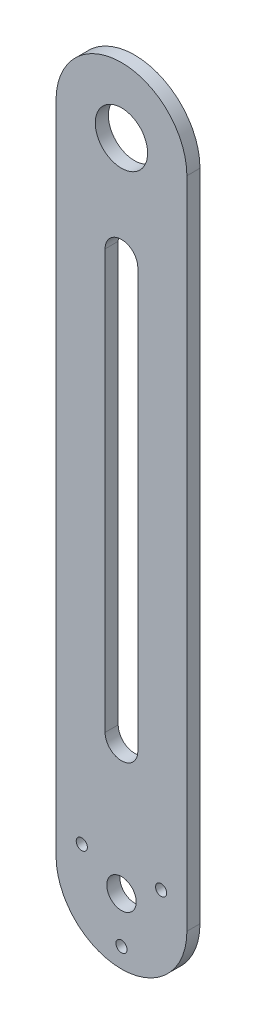
ISO-10303-21;
HEADER;
FILE_DESCRIPTION(('STEP AP214'),'2;1');
FILE_NAME('part.step','',(''),(''),'','','');
FILE_SCHEMA(('AUTOMOTIVE_DESIGN { 1 0 10303 214 1 1 1 1 }'));
ENDSEC;
DATA;
#1=APPLICATION_CONTEXT('core data for automotive mechanical design processes');
#2=APPLICATION_PROTOCOL_DEFINITION('international standard','automotive_design',2000,#1);
#3=PRODUCT_CONTEXT('',#1,'mechanical');
#4=PRODUCT('Part','Part','',(#3));
#5=PRODUCT_RELATED_PRODUCT_CATEGORY('part','',(#4));
#6=PRODUCT_DEFINITION_FORMATION('','',#4);
#7=PRODUCT_DEFINITION_CONTEXT('part definition',#1,'design');
#8=PRODUCT_DEFINITION('design','',#6,#7);
#9=PRODUCT_DEFINITION_SHAPE('','',#8);
#10=(LENGTH_UNIT() NAMED_UNIT(*) SI_UNIT(.MILLI.,.METRE.));
#11=(NAMED_UNIT(*) PLANE_ANGLE_UNIT() SI_UNIT($,.RADIAN.));
#12=(NAMED_UNIT(*) SI_UNIT($,.STERADIAN.) SOLID_ANGLE_UNIT());
#13=UNCERTAINTY_MEASURE_WITH_UNIT(LENGTH_MEASURE(1.E-05),#10,'distance_accuracy_value','');
#14=(GEOMETRIC_REPRESENTATION_CONTEXT(3) GLOBAL_UNCERTAINTY_ASSIGNED_CONTEXT((#13)) GLOBAL_UNIT_ASSIGNED_CONTEXT((#10,
#11,#12)) REPRESENTATION_CONTEXT('',''));
#15=CARTESIAN_POINT('',(0.,0.,0.));
#16=DIRECTION('',(0.,0.,1.));
#17=DIRECTION('',(1.,0.,0.));
#18=AXIS2_PLACEMENT_3D('',#15,#16,#17);
#19=CARTESIAN_POINT('',(0.,-200.,4.));
#20=DIRECTION('',(0.,0.,1.));
#21=DIRECTION('',(1.,0.,0.));
#22=AXIS2_PLACEMENT_3D('',#19,#20,#21);
#23=PLANE('',#22);
#24=CARTESIAN_POINT('',(0.,-214.,4.));
#25=DIRECTION('',(0.,0.,-1.));
#26=DIRECTION('',(-1.,0.,0.));
#27=AXIS2_PLACEMENT_3D('',#24,#25,#26);
#28=CIRCLE('',#27,1.7);
#29=CARTESIAN_POINT('',(-1.69999999999998,-214.,4.));
#30=VERTEX_POINT('',#29);
#31=EDGE_CURVE('E130',#30,#30,#28,.T.);
#32=ORIENTED_EDGE('',*,*,#31,.T.);
#33=EDGE_LOOP('',(#32));
#34=FACE_BOUND('',#33,.T.);
#35=CARTESIAN_POINT('',(12.1243556529821,-193.,4.));
#36=DIRECTION('',(0.,0.,-1.));
#37=DIRECTION('',(-1.,0.,0.));
#38=AXIS2_PLACEMENT_3D('',#35,#36,#37);
#39=CIRCLE('',#38,1.70000000000002);
#40=CARTESIAN_POINT('',(10.4243556529821,-193.,4.));
#41=VERTEX_POINT('',#40);
#42=EDGE_CURVE('E264',#41,#41,#39,.T.);
#43=ORIENTED_EDGE('',*,*,#42,.T.);
#44=EDGE_LOOP('',(#43));
#45=FACE_BOUND('',#44,.T.);
#46=CARTESIAN_POINT('',(-12.1243556529821,-193.,4.));
#47=DIRECTION('',(0.,0.,-1.));
#48=DIRECTION('',(-1.,0.,0.));
#49=AXIS2_PLACEMENT_3D('',#46,#47,#48);
#50=CIRCLE('',#49,1.69999999999999);
#51=CARTESIAN_POINT('',(-13.8243556529821,-193.,4.));
#52=VERTEX_POINT('',#51);
#53=EDGE_CURVE('E272',#52,#52,#50,.T.);
#54=ORIENTED_EDGE('',*,*,#53,.T.);
#55=EDGE_LOOP('',(#54));
#56=FACE_BOUND('',#55,.T.);
#57=CARTESIAN_POINT('',(0.,-31.8450046889655,4.));
#58=DIRECTION('',(0.,0.,1.));
#59=DIRECTION('',(-1.,0.,0.));
#60=AXIS2_PLACEMENT_3D('',#57,#58,#59);
#61=CIRCLE('',#60,5.00000000000001);
#62=CARTESIAN_POINT('',(5.00000000000002,-31.8450046889655,4.));
#63=VERTEX_POINT('',#62);
#64=CARTESIAN_POINT('',(-5.,-31.8450046889655,4.));
#65=VERTEX_POINT('',#64);
#66=EDGE_CURVE('E49',#63,#65,#61,.T.);
#67=ORIENTED_EDGE('',*,*,#66,.F.);
#68=DIRECTION('',(0.,1.,0.));
#69=VECTOR('',#68,1.);
#70=CARTESIAN_POINT('',(5.00000000000002,-159.845004688965,4.));
#71=LINE('',#70,#69);
#72=CARTESIAN_POINT('',(5.00000000000002,-159.845004688965,4.));
#73=VERTEX_POINT('',#72);
#74=EDGE_CURVE('E117',#73,#63,#71,.T.);
#75=ORIENTED_EDGE('',*,*,#74,.F.);
#76=CARTESIAN_POINT('',(0.,-159.845004688965,4.));
#77=DIRECTION('',(0.,0.,1.));
#78=DIRECTION('',(1.,0.,0.));
#79=AXIS2_PLACEMENT_3D('',#76,#77,#78);
#80=CIRCLE('',#79,5.);
#81=CARTESIAN_POINT('',(-4.99999999999998,-159.845004688965,4.));
#82=VERTEX_POINT('',#81);
#83=EDGE_CURVE('E120',#82,#73,#80,.T.);
#84=ORIENTED_EDGE('',*,*,#83,.F.);
#85=DIRECTION('',(0.,-1.,0.));
#86=VECTOR('',#85,1.);
#87=CARTESIAN_POINT('',(-5.,-31.8450046889655,4.));
#88=LINE('',#87,#86);
#89=EDGE_CURVE('E129',#65,#82,#88,.T.);
#90=ORIENTED_EDGE('',*,*,#89,.F.);
#91=EDGE_LOOP('',(#67,#75,#84,#90));
#92=FACE_BOUND('',#91,.T.);
#93=CARTESIAN_POINT('',(0.,0.,4.));
#94=DIRECTION('',(0.,0.,1.));
#95=DIRECTION('',(1.,0.,0.));
#96=AXIS2_PLACEMENT_3D('',#93,#94,#95);
#97=CIRCLE('',#96,8.);
#98=CARTESIAN_POINT('',(8.,0.,4.));
#99=VERTEX_POINT('',#98);
#100=EDGE_CURVE('E146',#99,#99,#97,.T.);
#101=ORIENTED_EDGE('',*,*,#100,.F.);
#102=EDGE_LOOP('',(#101));
#103=FACE_BOUND('',#102,.T.);
#104=CARTESIAN_POINT('',(0.,-200.,4.));
#105=DIRECTION('',(0.,0.,1.));
#106=DIRECTION('',(1.,0.,0.));
#107=AXIS2_PLACEMENT_3D('',#104,#105,#106);
#108=CIRCLE('',#107,20.);
#109=CARTESIAN_POINT('',(-20.,-200.,4.));
#110=VERTEX_POINT('',#109);
#111=CARTESIAN_POINT('',(20.,-200.,4.));
#112=VERTEX_POINT('',#111);
#113=EDGE_CURVE('E152',#110,#112,#108,.T.);
#114=ORIENTED_EDGE('',*,*,#113,.T.);
#115=DIRECTION('',(0.,1.,0.));
#116=VECTOR('',#115,1.);
#117=CARTESIAN_POINT('',(20.,-200.,4.));
#118=LINE('',#117,#116);
#119=CARTESIAN_POINT('',(20.,0.,4.));
#120=VERTEX_POINT('',#119);
#121=EDGE_CURVE('E155',#112,#120,#118,.T.);
#122=ORIENTED_EDGE('',*,*,#121,.T.);
#123=CARTESIAN_POINT('',(0.,0.,4.));
#124=DIRECTION('',(0.,0.,1.));
#125=DIRECTION('',(1.,0.,0.));
#126=AXIS2_PLACEMENT_3D('',#123,#124,#125);
#127=CIRCLE('',#126,20.);
#128=CARTESIAN_POINT('',(-20.,0.,4.));
#129=VERTEX_POINT('',#128);
#130=EDGE_CURVE('E158',#120,#129,#127,.T.);
#131=ORIENTED_EDGE('',*,*,#130,.T.);
#132=DIRECTION('',(0.,-1.,0.));
#133=VECTOR('',#132,1.);
#134=CARTESIAN_POINT('',(-20.,0.,4.));
#135=LINE('',#134,#133);
#136=EDGE_CURVE('E160',#129,#110,#135,.T.);
#137=ORIENTED_EDGE('',*,*,#136,.T.);
#138=EDGE_LOOP('',(#114,#122,#131,#137));
#139=FACE_BOUND('',#138,.T.);
#140=CARTESIAN_POINT('',(0.,-200.,4.));
#141=DIRECTION('',(0.,0.,1.));
#142=DIRECTION('',(1.,0.,0.));
#143=AXIS2_PLACEMENT_3D('',#140,#141,#142);
#144=CIRCLE('',#143,4.5);
#145=CARTESIAN_POINT('',(4.50000000000002,-200.,4.));
#146=VERTEX_POINT('',#145);
#147=EDGE_CURVE('E140',#146,#146,#144,.T.);
#148=ORIENTED_EDGE('',*,*,#147,.F.);
#149=EDGE_LOOP('',(#148));
#150=FACE_BOUND('',#149,.T.);
#151=ADVANCED_FACE('F34',(#34,#45,#56,#92,#103,#139,#150),#23,.T.);
#152=CARTESIAN_POINT('',(0.,-200.,0.));
#153=DIRECTION('',(0.,0.,1.));
#154=DIRECTION('',(1.,0.,0.));
#155=AXIS2_PLACEMENT_3D('',#152,#153,#154);
#156=PLANE('',#155);
#157=CARTESIAN_POINT('',(0.,-214.,0.));
#158=DIRECTION('',(0.,0.,-1.));
#159=DIRECTION('',(-1.,0.,0.));
#160=AXIS2_PLACEMENT_3D('',#157,#158,#159);
#161=CIRCLE('',#160,1.7);
#162=CARTESIAN_POINT('',(-1.69999999999998,-214.,0.));
#163=VERTEX_POINT('',#162);
#164=EDGE_CURVE('E263',#163,#163,#161,.T.);
#165=ORIENTED_EDGE('',*,*,#164,.F.);
#166=EDGE_LOOP('',(#165));
#167=FACE_BOUND('',#166,.T.);
#168=CARTESIAN_POINT('',(12.1243556529821,-193.,0.));
#169=DIRECTION('',(0.,0.,-1.));
#170=DIRECTION('',(-1.,0.,0.));
#171=AXIS2_PLACEMENT_3D('',#168,#169,#170);
#172=CIRCLE('',#171,1.70000000000002);
#173=CARTESIAN_POINT('',(10.4243556529821,-193.,0.));
#174=VERTEX_POINT('',#173);
#175=EDGE_CURVE('E268',#174,#174,#172,.T.);
#176=ORIENTED_EDGE('',*,*,#175,.F.);
#177=EDGE_LOOP('',(#176));
#178=FACE_BOUND('',#177,.T.);
#179=CARTESIAN_POINT('',(-12.1243556529821,-193.,0.));
#180=DIRECTION('',(0.,0.,-1.));
#181=DIRECTION('',(-1.,0.,0.));
#182=AXIS2_PLACEMENT_3D('',#179,#180,#181);
#183=CIRCLE('',#182,1.69999999999999);
#184=CARTESIAN_POINT('',(-13.8243556529821,-193.,0.));
#185=VERTEX_POINT('',#184);
#186=EDGE_CURVE('E123',#185,#185,#183,.T.);
#187=ORIENTED_EDGE('',*,*,#186,.F.);
#188=EDGE_LOOP('',(#187));
#189=FACE_BOUND('',#188,.T.);
#190=DIRECTION('',(0.,1.,0.));
#191=VECTOR('',#190,1.);
#192=CARTESIAN_POINT('',(5.00000000000002,-159.845004688965,0.));
#193=LINE('',#192,#191);
#194=CARTESIAN_POINT('',(5.00000000000002,-159.845004688965,0.));
#195=VERTEX_POINT('',#194);
#196=CARTESIAN_POINT('',(5.00000000000002,-31.8450046889655,0.));
#197=VERTEX_POINT('',#196);
#198=EDGE_CURVE('E107',#195,#197,#193,.T.);
#199=ORIENTED_EDGE('',*,*,#198,.T.);
#200=CARTESIAN_POINT('',(0.,-31.8450046889655,0.));
#201=DIRECTION('',(0.,0.,1.));
#202=DIRECTION('',(-1.,0.,0.));
#203=AXIS2_PLACEMENT_3D('',#200,#201,#202);
#204=CIRCLE('',#203,5.00000000000001);
#205=CARTESIAN_POINT('',(-5.,-31.8450046889655,0.));
#206=VERTEX_POINT('',#205);
#207=EDGE_CURVE('E101',#197,#206,#204,.T.);
#208=ORIENTED_EDGE('',*,*,#207,.T.);
#209=DIRECTION('',(0.,-1.,0.));
#210=VECTOR('',#209,1.);
#211=CARTESIAN_POINT('',(-5.,-31.8450046889655,0.));
#212=LINE('',#211,#210);
#213=CARTESIAN_POINT('',(-4.99999999999998,-159.845004688965,0.));
#214=VERTEX_POINT('',#213);
#215=EDGE_CURVE('E110',#206,#214,#212,.T.);
#216=ORIENTED_EDGE('',*,*,#215,.T.);
#217=CARTESIAN_POINT('',(0.,-159.845004688965,0.));
#218=DIRECTION('',(0.,0.,1.));
#219=DIRECTION('',(1.,0.,0.));
#220=AXIS2_PLACEMENT_3D('',#217,#218,#219);
#221=CIRCLE('',#220,5.);
#222=EDGE_CURVE('E57',#214,#195,#221,.T.);
#223=ORIENTED_EDGE('',*,*,#222,.T.);
#224=EDGE_LOOP('',(#199,#208,#216,#223));
#225=FACE_BOUND('',#224,.T.);
#226=CARTESIAN_POINT('',(0.,-200.,0.));
#227=DIRECTION('',(0.,0.,1.));
#228=DIRECTION('',(1.,0.,0.));
#229=AXIS2_PLACEMENT_3D('',#226,#227,#228);
#230=CIRCLE('',#229,20.);
#231=CARTESIAN_POINT('',(-20.,-200.,0.));
#232=VERTEX_POINT('',#231);
#233=CARTESIAN_POINT('',(20.,-200.,0.));
#234=VERTEX_POINT('',#233);
#235=EDGE_CURVE('E149',#232,#234,#230,.T.);
#236=ORIENTED_EDGE('',*,*,#235,.F.);
#237=DIRECTION('',(0.,-1.,0.));
#238=VECTOR('',#237,1.);
#239=CARTESIAN_POINT('',(-20.,0.,0.));
#240=LINE('',#239,#238);
#241=CARTESIAN_POINT('',(-20.,0.,0.));
#242=VERTEX_POINT('',#241);
#243=EDGE_CURVE('E156',#242,#232,#240,.T.);
#244=ORIENTED_EDGE('',*,*,#243,.F.);
#245=CARTESIAN_POINT('',(0.,0.,0.));
#246=DIRECTION('',(0.,0.,1.));
#247=DIRECTION('',(1.,0.,0.));
#248=AXIS2_PLACEMENT_3D('',#245,#246,#247);
#249=CIRCLE('',#248,20.);
#250=CARTESIAN_POINT('',(20.,0.,0.));
#251=VERTEX_POINT('',#250);
#252=EDGE_CURVE('E167',#251,#242,#249,.T.);
#253=ORIENTED_EDGE('',*,*,#252,.F.);
#254=DIRECTION('',(0.,1.,0.));
#255=VECTOR('',#254,1.);
#256=CARTESIAN_POINT('',(20.,-200.,0.));
#257=LINE('',#256,#255);
#258=EDGE_CURVE('E165',#234,#251,#257,.T.);
#259=ORIENTED_EDGE('',*,*,#258,.F.);
#260=EDGE_LOOP('',(#236,#244,#253,#259));
#261=FACE_BOUND('',#260,.T.);
#262=CARTESIAN_POINT('',(0.,0.,0.));
#263=DIRECTION('',(0.,0.,1.));
#264=DIRECTION('',(1.,0.,0.));
#265=AXIS2_PLACEMENT_3D('',#262,#263,#264);
#266=CIRCLE('',#265,8.);
#267=CARTESIAN_POINT('',(8.,0.,0.));
#268=VERTEX_POINT('',#267);
#269=EDGE_CURVE('E143',#268,#268,#266,.T.);
#270=ORIENTED_EDGE('',*,*,#269,.T.);
#271=EDGE_LOOP('',(#270));
#272=FACE_BOUND('',#271,.T.);
#273=CARTESIAN_POINT('',(0.,-200.,0.));
#274=DIRECTION('',(0.,0.,1.));
#275=DIRECTION('',(1.,0.,0.));
#276=AXIS2_PLACEMENT_3D('',#273,#274,#275);
#277=CIRCLE('',#276,4.5);
#278=CARTESIAN_POINT('',(4.50000000000002,-200.,0.));
#279=VERTEX_POINT('',#278);
#280=EDGE_CURVE('E136',#279,#279,#277,.T.);
#281=ORIENTED_EDGE('',*,*,#280,.T.);
#282=EDGE_LOOP('',(#281));
#283=FACE_BOUND('',#282,.T.);
#284=ADVANCED_FACE('F114',(#167,#178,#189,#225,#261,#272,#283),#156,.F.);
#285=CARTESIAN_POINT('',(0.,-200.,4.));
#286=DIRECTION('',(0.,0.,-1.));
#287=DIRECTION('',(-1.,0.,0.));
#288=AXIS2_PLACEMENT_3D('',#285,#286,#287);
#289=CYLINDRICAL_SURFACE('',#288,20.);
#290=ORIENTED_EDGE('',*,*,#235,.T.);
#291=DIRECTION('',(0.,0.,-1.));
#292=VECTOR('',#291,1.);
#293=CARTESIAN_POINT('',(20.,-200.,4.));
#294=LINE('',#293,#292);
#295=EDGE_CURVE('E11',#112,#234,#294,.T.);
#296=ORIENTED_EDGE('',*,*,#295,.F.);
#297=ORIENTED_EDGE('',*,*,#113,.F.);
#298=DIRECTION('',(0.,0.,-1.));
#299=VECTOR('',#298,1.);
#300=CARTESIAN_POINT('',(-20.,-200.,4.));
#301=LINE('',#300,#299);
#302=EDGE_CURVE('E162',#110,#232,#301,.T.);
#303=ORIENTED_EDGE('',*,*,#302,.T.);
#304=EDGE_LOOP('',(#290,#296,#297,#303));
#305=FACE_BOUND('',#304,.T.);
#306=ADVANCED_FACE('F36',(#305),#289,.T.);
#307=CARTESIAN_POINT('',(20.,-200.,4.));
#308=DIRECTION('',(-1.,0.,0.));
#309=DIRECTION('',(0.,-1.,0.));
#310=AXIS2_PLACEMENT_3D('',#307,#308,#309);
#311=PLANE('',#310);
#312=ORIENTED_EDGE('',*,*,#258,.T.);
#313=DIRECTION('',(0.,0.,-1.));
#314=VECTOR('',#313,1.);
#315=CARTESIAN_POINT('',(20.,0.,4.));
#316=LINE('',#315,#314);
#317=EDGE_CURVE('E42',#120,#251,#316,.T.);
#318=ORIENTED_EDGE('',*,*,#317,.F.);
#319=ORIENTED_EDGE('',*,*,#121,.F.);
#320=ORIENTED_EDGE('',*,*,#295,.T.);
#321=EDGE_LOOP('',(#312,#318,#319,#320));
#322=FACE_BOUND('',#321,.T.);
#323=ADVANCED_FACE('F194',(#322),#311,.F.);
#324=CARTESIAN_POINT('',(0.,0.,4.));
#325=DIRECTION('',(0.,0.,-1.));
#326=DIRECTION('',(-1.,0.,0.));
#327=AXIS2_PLACEMENT_3D('',#324,#325,#326);
#328=CYLINDRICAL_SURFACE('',#327,20.);
#329=ORIENTED_EDGE('',*,*,#252,.T.);
#330=DIRECTION('',(0.,0.,-1.));
#331=VECTOR('',#330,1.);
#332=CARTESIAN_POINT('',(-20.,0.,4.));
#333=LINE('',#332,#331);
#334=EDGE_CURVE('E172',#129,#242,#333,.T.);
#335=ORIENTED_EDGE('',*,*,#334,.F.);
#336=ORIENTED_EDGE('',*,*,#130,.F.);
#337=ORIENTED_EDGE('',*,*,#317,.T.);
#338=EDGE_LOOP('',(#329,#335,#336,#337));
#339=FACE_BOUND('',#338,.T.);
#340=ADVANCED_FACE('F179',(#339),#328,.T.);
#341=CARTESIAN_POINT('',(-20.,0.,4.));
#342=DIRECTION('',(1.,0.,0.));
#343=DIRECTION('',(0.,1.,0.));
#344=AXIS2_PLACEMENT_3D('',#341,#342,#343);
#345=PLANE('',#344);
#346=ORIENTED_EDGE('',*,*,#243,.T.);
#347=ORIENTED_EDGE('',*,*,#302,.F.);
#348=ORIENTED_EDGE('',*,*,#136,.F.);
#349=ORIENTED_EDGE('',*,*,#334,.T.);
#350=EDGE_LOOP('',(#346,#347,#348,#349));
#351=FACE_BOUND('',#350,.T.);
#352=ADVANCED_FACE('F187',(#351),#345,.F.);
#353=CARTESIAN_POINT('',(0.,0.,4.));
#354=DIRECTION('',(0.,0.,-1.));
#355=DIRECTION('',(-1.,0.,0.));
#356=AXIS2_PLACEMENT_3D('',#353,#354,#355);
#357=CYLINDRICAL_SURFACE('',#356,8.);
#358=ORIENTED_EDGE('',*,*,#100,.T.);
#359=EDGE_LOOP('',(#358));
#360=FACE_BOUND('',#359,.T.);
#361=ORIENTED_EDGE('',*,*,#269,.F.);
#362=EDGE_LOOP('',(#361));
#363=FACE_BOUND('',#362,.T.);
#364=ADVANCED_FACE('F212',(#360,#363),#357,.F.);
#365=CARTESIAN_POINT('',(0.,-200.,4.));
#366=DIRECTION('',(0.,0.,-1.));
#367=DIRECTION('',(-1.,0.,0.));
#368=AXIS2_PLACEMENT_3D('',#365,#366,#367);
#369=CYLINDRICAL_SURFACE('',#368,4.5);
#370=ORIENTED_EDGE('',*,*,#147,.T.);
#371=EDGE_LOOP('',(#370));
#372=FACE_BOUND('',#371,.T.);
#373=ORIENTED_EDGE('',*,*,#280,.F.);
#374=EDGE_LOOP('',(#373));
#375=FACE_BOUND('',#374,.T.);
#376=ADVANCED_FACE('F219',(#372,#375),#369,.F.);
#377=CARTESIAN_POINT('',(0.,-31.8450046889655,0.));
#378=DIRECTION('',(0.,0.,1.));
#379=DIRECTION('',(1.,0.,0.));
#380=AXIS2_PLACEMENT_3D('',#377,#378,#379);
#381=CYLINDRICAL_SURFACE('',#380,5.00000000000001);
#382=ORIENTED_EDGE('',*,*,#66,.T.);
#383=DIRECTION('',(0.,0.,1.));
#384=VECTOR('',#383,1.);
#385=CARTESIAN_POINT('',(-5.,-31.8450046889655,0.));
#386=LINE('',#385,#384);
#387=EDGE_CURVE('E97',#206,#65,#386,.T.);
#388=ORIENTED_EDGE('',*,*,#387,.F.);
#389=ORIENTED_EDGE('',*,*,#207,.F.);
#390=DIRECTION('',(0.,0.,1.));
#391=VECTOR('',#390,1.);
#392=CARTESIAN_POINT('',(5.00000000000002,-31.8450046889655,0.));
#393=LINE('',#392,#391);
#394=EDGE_CURVE('E134',#197,#63,#393,.T.);
#395=ORIENTED_EDGE('',*,*,#394,.T.);
#396=EDGE_LOOP('',(#382,#388,#389,#395));
#397=FACE_BOUND('',#396,.T.);
#398=ADVANCED_FACE('F99',(#397),#381,.F.);
#399=CARTESIAN_POINT('',(5.00000000000002,-159.845004688965,0.));
#400=DIRECTION('',(1.,0.,0.));
#401=DIRECTION('',(0.,1.,0.));
#402=AXIS2_PLACEMENT_3D('',#399,#400,#401);
#403=PLANE('',#402);
#404=ORIENTED_EDGE('',*,*,#74,.T.);
#405=ORIENTED_EDGE('',*,*,#394,.F.);
#406=ORIENTED_EDGE('',*,*,#198,.F.);
#407=DIRECTION('',(0.,0.,1.));
#408=VECTOR('',#407,1.);
#409=CARTESIAN_POINT('',(5.00000000000002,-159.845004688965,0.));
#410=LINE('',#409,#408);
#411=EDGE_CURVE('E137',#195,#73,#410,.T.);
#412=ORIENTED_EDGE('',*,*,#411,.T.);
#413=EDGE_LOOP('',(#404,#405,#406,#412));
#414=FACE_BOUND('',#413,.T.);
#415=ADVANCED_FACE('F235',(#414),#403,.F.);
#416=CARTESIAN_POINT('',(0.,-159.845004688965,0.));
#417=DIRECTION('',(0.,0.,1.));
#418=DIRECTION('',(1.,0.,0.));
#419=AXIS2_PLACEMENT_3D('',#416,#417,#418);
#420=CYLINDRICAL_SURFACE('',#419,5.);
#421=ORIENTED_EDGE('',*,*,#83,.T.);
#422=ORIENTED_EDGE('',*,*,#411,.F.);
#423=ORIENTED_EDGE('',*,*,#222,.F.);
#424=DIRECTION('',(0.,0.,1.));
#425=VECTOR('',#424,1.);
#426=CARTESIAN_POINT('',(-4.99999999999998,-159.845004688965,0.));
#427=LINE('',#426,#425);
#428=EDGE_CURVE('E106',#214,#82,#427,.T.);
#429=ORIENTED_EDGE('',*,*,#428,.T.);
#430=EDGE_LOOP('',(#421,#422,#423,#429));
#431=FACE_BOUND('',#430,.T.);
#432=ADVANCED_FACE('F241',(#431),#420,.F.);
#433=CARTESIAN_POINT('',(-5.,-31.8450046889655,0.));
#434=DIRECTION('',(-1.,0.,0.));
#435=DIRECTION('',(0.,-1.,0.));
#436=AXIS2_PLACEMENT_3D('',#433,#434,#435);
#437=PLANE('',#436);
#438=ORIENTED_EDGE('',*,*,#89,.T.);
#439=ORIENTED_EDGE('',*,*,#428,.F.);
#440=ORIENTED_EDGE('',*,*,#215,.F.);
#441=ORIENTED_EDGE('',*,*,#387,.T.);
#442=EDGE_LOOP('',(#438,#439,#440,#441));
#443=FACE_BOUND('',#442,.T.);
#444=ADVANCED_FACE('F111',(#443),#437,.F.);
#445=CARTESIAN_POINT('',(-12.1243556529821,-193.,4.));
#446=DIRECTION('',(0.,0.,-1.));
#447=DIRECTION('',(-1.,0.,0.));
#448=AXIS2_PLACEMENT_3D('',#445,#446,#447);
#449=CYLINDRICAL_SURFACE('',#448,1.69999999999999);
#450=ORIENTED_EDGE('',*,*,#53,.F.);
#451=EDGE_LOOP('',(#450));
#452=FACE_BOUND('',#451,.T.);
#453=ORIENTED_EDGE('',*,*,#186,.T.);
#454=EDGE_LOOP('',(#453));
#455=FACE_BOUND('',#454,.T.);
#456=ADVANCED_FACE('F240',(#452,#455),#449,.F.);
#457=CARTESIAN_POINT('',(12.1243556529821,-193.,4.));
#458=DIRECTION('',(0.,0.,-1.));
#459=DIRECTION('',(-1.,0.,0.));
#460=AXIS2_PLACEMENT_3D('',#457,#458,#459);
#461=CYLINDRICAL_SURFACE('',#460,1.70000000000002);
#462=ORIENTED_EDGE('',*,*,#42,.F.);
#463=EDGE_LOOP('',(#462));
#464=FACE_BOUND('',#463,.T.);
#465=ORIENTED_EDGE('',*,*,#175,.T.);
#466=EDGE_LOOP('',(#465));
#467=FACE_BOUND('',#466,.T.);
#468=ADVANCED_FACE('F249',(#464,#467),#461,.F.);
#469=CARTESIAN_POINT('',(0.,-214.,4.));
#470=DIRECTION('',(0.,0.,-1.));
#471=DIRECTION('',(-1.,0.,0.));
#472=AXIS2_PLACEMENT_3D('',#469,#470,#471);
#473=CYLINDRICAL_SURFACE('',#472,1.7);
#474=ORIENTED_EDGE('',*,*,#31,.F.);
#475=EDGE_LOOP('',(#474));
#476=FACE_BOUND('',#475,.T.);
#477=ORIENTED_EDGE('',*,*,#164,.T.);
#478=EDGE_LOOP('',(#477));
#479=FACE_BOUND('',#478,.T.);
#480=ADVANCED_FACE('F253',(#476,#479),#473,.F.);
#481=CLOSED_SHELL('',(#151,#284,#306,#323,#340,#352,#364,#376,#398,#415,#432,#444,#456,#468,#480));
#482=MANIFOLD_SOLID_BREP('B2',#481);
#483=ADVANCED_BREP_SHAPE_REPRESENTATION('',(#18,#482),#14);
#484=SHAPE_DEFINITION_REPRESENTATION(#9,#483);
ENDSEC;
END-ISO-10303-21;
